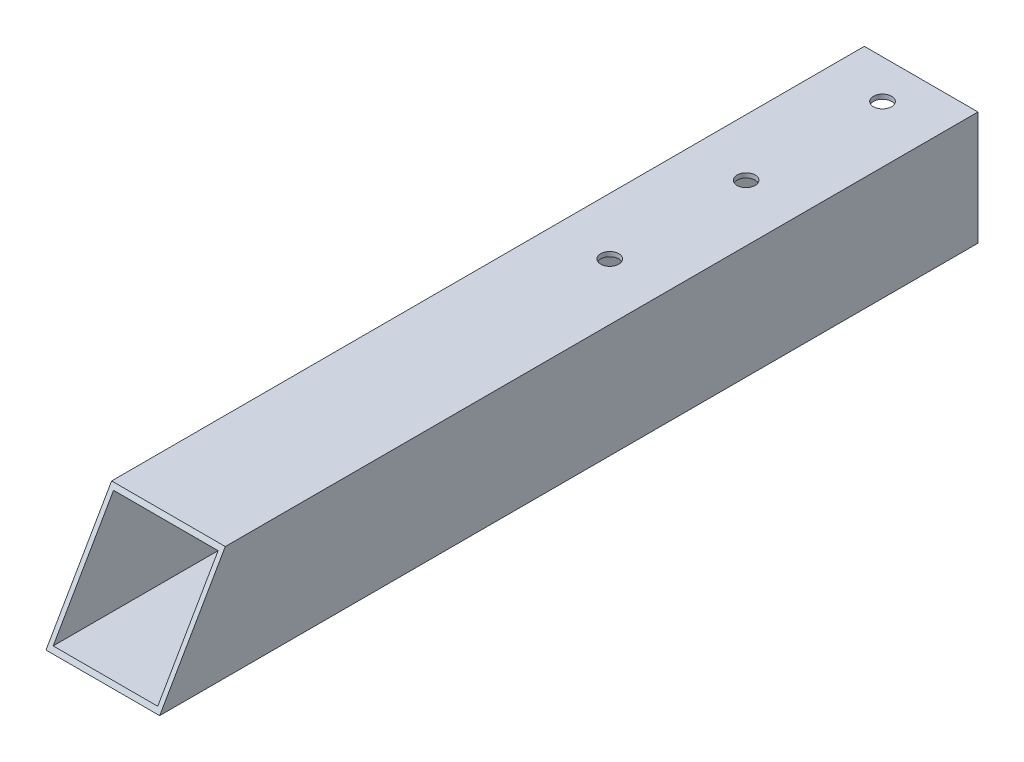
ISO-10303-21;
HEADER;
FILE_DESCRIPTION(('STEP AP214'),'2;1');
FILE_NAME('part.step','',(''),(''),'','','');
FILE_SCHEMA(('AUTOMOTIVE_DESIGN { 1 0 10303 214 1 1 1 1 }'));
ENDSEC;
DATA;
#1=APPLICATION_CONTEXT('core data for automotive mechanical design processes');
#2=APPLICATION_PROTOCOL_DEFINITION('international standard','automotive_design',2000,#1);
#3=PRODUCT_CONTEXT('',#1,'mechanical');
#4=PRODUCT('Part','Part','',(#3));
#5=PRODUCT_RELATED_PRODUCT_CATEGORY('part','',(#4));
#6=PRODUCT_DEFINITION_FORMATION('','',#4);
#7=PRODUCT_DEFINITION_CONTEXT('part definition',#1,'design');
#8=PRODUCT_DEFINITION('design','',#6,#7);
#9=PRODUCT_DEFINITION_SHAPE('','',#8);
#10=(LENGTH_UNIT() NAMED_UNIT(*) SI_UNIT(.MILLI.,.METRE.));
#11=(NAMED_UNIT(*) PLANE_ANGLE_UNIT() SI_UNIT($,.RADIAN.));
#12=(NAMED_UNIT(*) SI_UNIT($,.STERADIAN.) SOLID_ANGLE_UNIT());
#13=UNCERTAINTY_MEASURE_WITH_UNIT(LENGTH_MEASURE(1.E-05),#10,'distance_accuracy_value','');
#14=(GEOMETRIC_REPRESENTATION_CONTEXT(3) GLOBAL_UNCERTAINTY_ASSIGNED_CONTEXT((#13)) GLOBAL_UNIT_ASSIGNED_CONTEXT((#10,
#11,#12)) REPRESENTATION_CONTEXT('',''));
#15=CARTESIAN_POINT('',(0.,0.,0.));
#16=DIRECTION('',(0.,0.,1.));
#17=DIRECTION('',(1.,0.,0.));
#18=AXIS2_PLACEMENT_3D('',#15,#16,#17);
#19=CARTESIAN_POINT('',(0.,0.,0.));
#20=DIRECTION('',(0.,0.,-1.));
#21=DIRECTION('',(-1.,0.,0.));
#22=AXIS2_PLACEMENT_3D('',#19,#20,#21);
#23=PLANE('',#22);
#24=DIRECTION('',(0.,1.,0.));
#25=VECTOR('',#24,1.);
#26=CARTESIAN_POINT('',(12.5,-12.5,0.));
#27=LINE('',#26,#25);
#28=CARTESIAN_POINT('',(12.5,-12.5,0.));
#29=VERTEX_POINT('',#28);
#30=CARTESIAN_POINT('',(12.5,12.5,0.));
#31=VERTEX_POINT('',#30);
#32=EDGE_CURVE('E137',#29,#31,#27,.T.);
#33=ORIENTED_EDGE('',*,*,#32,.F.);
#34=DIRECTION('',(1.,0.,0.));
#35=VECTOR('',#34,1.);
#36=CARTESIAN_POINT('',(-12.5,-12.5,0.));
#37=LINE('',#36,#35);
#38=CARTESIAN_POINT('',(-12.5,-12.5,0.));
#39=VERTEX_POINT('',#38);
#40=EDGE_CURVE('E132',#39,#29,#37,.T.);
#41=ORIENTED_EDGE('',*,*,#40,.F.);
#42=DIRECTION('',(0.,-1.,0.));
#43=VECTOR('',#42,1.);
#44=CARTESIAN_POINT('',(-12.5,-12.5,0.));
#45=LINE('',#44,#43);
#46=CARTESIAN_POINT('',(-12.5,12.5,0.));
#47=VERTEX_POINT('',#46);
#48=EDGE_CURVE('E134',#47,#39,#45,.T.);
#49=ORIENTED_EDGE('',*,*,#48,.F.);
#50=DIRECTION('',(-1.,0.,0.));
#51=VECTOR('',#50,1.);
#52=CARTESIAN_POINT('',(-12.5,12.5,0.));
#53=LINE('',#52,#51);
#54=EDGE_CURVE('E123',#31,#47,#53,.T.);
#55=ORIENTED_EDGE('',*,*,#54,.F.);
#56=EDGE_LOOP('',(#33,#41,#49,#55));
#57=FACE_BOUND('',#56,.T.);
#58=DIRECTION('',(-1.,0.,0.));
#59=VECTOR('',#58,1.);
#60=CARTESIAN_POINT('',(-11.5,11.5,0.));
#61=LINE('',#60,#59);
#62=CARTESIAN_POINT('',(11.5,11.5,0.));
#63=VERTEX_POINT('',#62);
#64=CARTESIAN_POINT('',(-11.5,11.5,0.));
#65=VERTEX_POINT('',#64);
#66=EDGE_CURVE('E148',#63,#65,#61,.T.);
#67=ORIENTED_EDGE('',*,*,#66,.T.);
#68=DIRECTION('',(0.,-1.,0.));
#69=VECTOR('',#68,1.);
#70=CARTESIAN_POINT('',(-11.5,-11.5,0.));
#71=LINE('',#70,#69);
#72=CARTESIAN_POINT('',(-11.5,-11.5,0.));
#73=VERTEX_POINT('',#72);
#74=EDGE_CURVE('E157',#65,#73,#71,.T.);
#75=ORIENTED_EDGE('',*,*,#74,.T.);
#76=DIRECTION('',(1.,0.,0.));
#77=VECTOR('',#76,1.);
#78=CARTESIAN_POINT('',(-11.5,-11.5,0.));
#79=LINE('',#78,#77);
#80=CARTESIAN_POINT('',(11.5,-11.5,0.));
#81=VERTEX_POINT('',#80);
#82=EDGE_CURVE('E154',#73,#81,#79,.T.);
#83=ORIENTED_EDGE('',*,*,#82,.T.);
#84=DIRECTION('',(0.,1.,0.));
#85=VECTOR('',#84,1.);
#86=CARTESIAN_POINT('',(11.5,-11.5,0.));
#87=LINE('',#86,#85);
#88=EDGE_CURVE('E151',#81,#63,#87,.T.);
#89=ORIENTED_EDGE('',*,*,#88,.T.);
#90=EDGE_LOOP('',(#67,#75,#83,#89));
#91=FACE_BOUND('',#90,.T.);
#92=ADVANCED_FACE('F37',(#57,#91),#23,.T.);
#93=CARTESIAN_POINT('',(12.5,-12.5,180.));
#94=DIRECTION('',(-1.,0.,0.));
#95=DIRECTION('',(0.,0.,1.));
#96=AXIS2_PLACEMENT_3D('',#93,#94,#95);
#97=PLANE('',#96);
#98=DIRECTION('',(0.,0.,-1.));
#99=VECTOR('',#98,1.);
#100=CARTESIAN_POINT('',(12.5,12.5,180.));
#101=LINE('',#100,#99);
#102=CARTESIAN_POINT('',(12.5,12.5,165.56624327026));
#103=VERTEX_POINT('',#102);
#104=EDGE_CURVE('E45',#103,#31,#101,.T.);
#105=ORIENTED_EDGE('',*,*,#104,.F.);
#106=DIRECTION('',(0.,0.866025403784442,-0.499999999999994));
#107=VECTOR('',#106,1.);
#108=CARTESIAN_POINT('',(12.5,-12.5,180.));
#109=LINE('',#108,#107);
#110=CARTESIAN_POINT('',(12.5,-12.5,180.));
#111=VERTEX_POINT('',#110);
#112=EDGE_CURVE('E107',#111,#103,#109,.T.);
#113=ORIENTED_EDGE('',*,*,#112,.F.);
#114=DIRECTION('',(0.,0.,-1.));
#115=VECTOR('',#114,1.);
#116=CARTESIAN_POINT('',(12.5,-12.5,180.));
#117=LINE('',#116,#115);
#118=EDGE_CURVE('E126',#111,#29,#117,.T.);
#119=ORIENTED_EDGE('',*,*,#118,.T.);
#120=ORIENTED_EDGE('',*,*,#32,.T.);
#121=EDGE_LOOP('',(#105,#113,#119,#120));
#122=FACE_BOUND('',#121,.T.);
#123=ADVANCED_FACE('F39',(#122),#97,.F.);
#124=CARTESIAN_POINT('',(-12.5,12.5,180.));
#125=DIRECTION('',(0.,-1.,0.));
#126=DIRECTION('',(0.,0.,-1.));
#127=AXIS2_PLACEMENT_3D('',#124,#125,#126);
#128=PLANE('',#127);
#129=CARTESIAN_POINT('',(0.,12.5,8.5));
#130=DIRECTION('',(0.,1.,0.));
#131=DIRECTION('',(0.,0.,1.));
#132=AXIS2_PLACEMENT_3D('',#129,#130,#131);
#133=CIRCLE('',#132,2.);
#134=CARTESIAN_POINT('',(0.,12.5,10.5));
#135=VERTEX_POINT('',#134);
#136=EDGE_CURVE('E164',#135,#135,#133,.T.);
#137=ORIENTED_EDGE('',*,*,#136,.F.);
#138=EDGE_LOOP('',(#137));
#139=FACE_BOUND('',#138,.T.);
#140=CARTESIAN_POINT('',(0.,12.5,38.5));
#141=DIRECTION('',(0.,1.,0.));
#142=DIRECTION('',(0.,0.,1.));
#143=AXIS2_PLACEMENT_3D('',#140,#141,#142);
#144=CIRCLE('',#143,2.);
#145=CARTESIAN_POINT('',(0.,12.5,40.5));
#146=VERTEX_POINT('',#145);
#147=EDGE_CURVE('E172',#146,#146,#144,.T.);
#148=ORIENTED_EDGE('',*,*,#147,.F.);
#149=EDGE_LOOP('',(#148));
#150=FACE_BOUND('',#149,.T.);
#151=CARTESIAN_POINT('',(0.,12.5,68.5));
#152=DIRECTION('',(0.,1.,0.));
#153=DIRECTION('',(0.,0.,1.));
#154=AXIS2_PLACEMENT_3D('',#151,#152,#153);
#155=CIRCLE('',#154,2.);
#156=CARTESIAN_POINT('',(0.,12.5,70.5));
#157=VERTEX_POINT('',#156);
#158=EDGE_CURVE('E166',#157,#157,#155,.T.);
#159=ORIENTED_EDGE('',*,*,#158,.F.);
#160=EDGE_LOOP('',(#159));
#161=FACE_BOUND('',#160,.T.);
#162=DIRECTION('',(0.,0.,-1.));
#163=VECTOR('',#162,1.);
#164=CARTESIAN_POINT('',(-12.5,12.5,180.));
#165=LINE('',#164,#163);
#166=CARTESIAN_POINT('',(-12.5,12.5,165.56624327026));
#167=VERTEX_POINT('',#166);
#168=EDGE_CURVE('E115',#167,#47,#165,.T.);
#169=ORIENTED_EDGE('',*,*,#168,.F.);
#170=DIRECTION('',(1.,0.,0.));
#171=VECTOR('',#170,1.);
#172=CARTESIAN_POINT('',(-12.5,12.5,165.56624327026));
#173=LINE('',#172,#171);
#174=EDGE_CURVE('E101',#167,#103,#173,.T.);
#175=ORIENTED_EDGE('',*,*,#174,.T.);
#176=ORIENTED_EDGE('',*,*,#104,.T.);
#177=ORIENTED_EDGE('',*,*,#54,.T.);
#178=EDGE_LOOP('',(#169,#175,#176,#177));
#179=FACE_BOUND('',#178,.T.);
#180=ADVANCED_FACE('F121',(#139,#150,#161,#179),#128,.F.);
#181=CARTESIAN_POINT('',(-12.5,-12.5,180.));
#182=DIRECTION('',(1.,0.,0.));
#183=DIRECTION('',(0.,0.,-1.));
#184=AXIS2_PLACEMENT_3D('',#181,#182,#183);
#185=PLANE('',#184);
#186=DIRECTION('',(0.,0.,-1.));
#187=VECTOR('',#186,1.);
#188=CARTESIAN_POINT('',(-12.5,-12.5,180.));
#189=LINE('',#188,#187);
#190=CARTESIAN_POINT('',(-12.5,-12.5,180.));
#191=VERTEX_POINT('',#190);
#192=EDGE_CURVE('E118',#191,#39,#189,.T.);
#193=ORIENTED_EDGE('',*,*,#192,.F.);
#194=DIRECTION('',(0.,0.866025403784442,-0.499999999999994));
#195=VECTOR('',#194,1.);
#196=CARTESIAN_POINT('',(-12.5,-12.5,180.));
#197=LINE('',#196,#195);
#198=EDGE_CURVE('E104',#191,#167,#197,.T.);
#199=ORIENTED_EDGE('',*,*,#198,.T.);
#200=ORIENTED_EDGE('',*,*,#168,.T.);
#201=ORIENTED_EDGE('',*,*,#48,.T.);
#202=EDGE_LOOP('',(#193,#199,#200,#201));
#203=FACE_BOUND('',#202,.T.);
#204=ADVANCED_FACE('F114',(#203),#185,.F.);
#205=CARTESIAN_POINT('',(-12.5,-12.5,180.));
#206=DIRECTION('',(0.,1.,0.));
#207=DIRECTION('',(0.,0.,1.));
#208=AXIS2_PLACEMENT_3D('',#205,#206,#207);
#209=PLANE('',#208);
#210=ORIENTED_EDGE('',*,*,#40,.T.);
#211=ORIENTED_EDGE('',*,*,#118,.F.);
#212=DIRECTION('',(1.,0.,0.));
#213=VECTOR('',#212,1.);
#214=CARTESIAN_POINT('',(-12.5,-12.5,180.));
#215=LINE('',#214,#213);
#216=EDGE_CURVE('E131',#191,#111,#215,.T.);
#217=ORIENTED_EDGE('',*,*,#216,.F.);
#218=ORIENTED_EDGE('',*,*,#192,.T.);
#219=EDGE_LOOP('',(#210,#211,#217,#218));
#220=FACE_BOUND('',#219,.T.);
#221=ADVANCED_FACE('F219',(#220),#209,.F.);
#222=CARTESIAN_POINT('',(-11.5,-11.5,180.));
#223=DIRECTION('',(1.,0.,0.));
#224=DIRECTION('',(0.,0.,-1.));
#225=AXIS2_PLACEMENT_3D('',#222,#223,#224);
#226=PLANE('',#225);
#227=DIRECTION('',(0.,0.866025403784442,-0.499999999999994));
#228=VECTOR('',#227,1.);
#229=CARTESIAN_POINT('',(-11.5,-11.75,179.566987298108));
#230=LINE('',#229,#228);
#231=CARTESIAN_POINT('',(-11.5,-11.5,179.42264973081));
#232=VERTEX_POINT('',#231);
#233=CARTESIAN_POINT('',(-11.5,11.5,166.143593539449));
#234=VERTEX_POINT('',#233);
#235=EDGE_CURVE('E51',#232,#234,#230,.T.);
#236=ORIENTED_EDGE('',*,*,#235,.F.);
#237=DIRECTION('',(0.,0.,-1.));
#238=VECTOR('',#237,1.);
#239=CARTESIAN_POINT('',(-11.5,-11.5,180.));
#240=LINE('',#239,#238);
#241=EDGE_CURVE('E140',#232,#73,#240,.T.);
#242=ORIENTED_EDGE('',*,*,#241,.T.);
#243=ORIENTED_EDGE('',*,*,#74,.F.);
#244=DIRECTION('',(0.,0.,-1.));
#245=VECTOR('',#244,1.);
#246=CARTESIAN_POINT('',(-11.5,11.5,180.));
#247=LINE('',#246,#245);
#248=EDGE_CURVE('E58',#234,#65,#247,.T.);
#249=ORIENTED_EDGE('',*,*,#248,.F.);
#250=EDGE_LOOP('',(#236,#242,#243,#249));
#251=FACE_BOUND('',#250,.T.);
#252=ADVANCED_FACE('F217',(#251),#226,.T.);
#253=CARTESIAN_POINT('',(-11.5,-11.5,180.));
#254=DIRECTION('',(0.,1.,0.));
#255=DIRECTION('',(0.,0.,1.));
#256=AXIS2_PLACEMENT_3D('',#253,#254,#255);
#257=PLANE('',#256);
#258=DIRECTION('',(-1.,0.,0.));
#259=VECTOR('',#258,1.);
#260=CARTESIAN_POINT('',(-11.5,-11.5,179.42264973081));
#261=LINE('',#260,#259);
#262=CARTESIAN_POINT('',(11.5,-11.5,179.42264973081));
#263=VERTEX_POINT('',#262);
#264=EDGE_CURVE('E161',#263,#232,#261,.T.);
#265=ORIENTED_EDGE('',*,*,#264,.F.);
#266=DIRECTION('',(0.,0.,-1.));
#267=VECTOR('',#266,1.);
#268=CARTESIAN_POINT('',(11.5,-11.5,180.));
#269=LINE('',#268,#267);
#270=EDGE_CURVE('E143',#263,#81,#269,.T.);
#271=ORIENTED_EDGE('',*,*,#270,.T.);
#272=ORIENTED_EDGE('',*,*,#82,.F.);
#273=ORIENTED_EDGE('',*,*,#241,.F.);
#274=EDGE_LOOP('',(#265,#271,#272,#273));
#275=FACE_BOUND('',#274,.T.);
#276=ADVANCED_FACE('F239',(#275),#257,.T.);
#277=CARTESIAN_POINT('',(11.5,-11.5,180.));
#278=DIRECTION('',(-1.,0.,0.));
#279=DIRECTION('',(0.,-1.,0.));
#280=AXIS2_PLACEMENT_3D('',#277,#278,#279);
#281=PLANE('',#280);
#282=DIRECTION('',(0.,-0.866025403784442,0.499999999999994));
#283=VECTOR('',#282,1.);
#284=CARTESIAN_POINT('',(11.5,-11.75,179.566987298108));
#285=LINE('',#284,#283);
#286=CARTESIAN_POINT('',(11.5,11.5,166.143593539449));
#287=VERTEX_POINT('',#286);
#288=EDGE_CURVE('E111',#287,#263,#285,.T.);
#289=ORIENTED_EDGE('',*,*,#288,.F.);
#290=DIRECTION('',(0.,0.,-1.));
#291=VECTOR('',#290,1.);
#292=CARTESIAN_POINT('',(11.5,11.5,180.));
#293=LINE('',#292,#291);
#294=EDGE_CURVE('E145',#287,#63,#293,.T.);
#295=ORIENTED_EDGE('',*,*,#294,.T.);
#296=ORIENTED_EDGE('',*,*,#88,.F.);
#297=ORIENTED_EDGE('',*,*,#270,.F.);
#298=EDGE_LOOP('',(#289,#295,#296,#297));
#299=FACE_BOUND('',#298,.T.);
#300=ADVANCED_FACE('F246',(#299),#281,.T.);
#301=CARTESIAN_POINT('',(-11.5,11.5,180.));
#302=DIRECTION('',(0.,-1.,0.));
#303=DIRECTION('',(1.,0.,0.));
#304=AXIS2_PLACEMENT_3D('',#301,#302,#303);
#305=PLANE('',#304);
#306=CARTESIAN_POINT('',(0.,11.5,8.5));
#307=DIRECTION('',(0.,-1.,0.));
#308=DIRECTION('',(1.,0.,0.));
#309=AXIS2_PLACEMENT_3D('',#306,#307,#308);
#310=CIRCLE('',#309,2.);
#311=CARTESIAN_POINT('',(2.,11.5,8.5));
#312=VERTEX_POINT('',#311);
#313=EDGE_CURVE('E178',#312,#312,#310,.F.);
#314=ORIENTED_EDGE('',*,*,#313,.T.);
#315=EDGE_LOOP('',(#314));
#316=FACE_BOUND('',#315,.T.);
#317=CARTESIAN_POINT('',(0.,11.5,38.5));
#318=DIRECTION('',(0.,-1.,0.));
#319=DIRECTION('',(1.,0.,0.));
#320=AXIS2_PLACEMENT_3D('',#317,#318,#319);
#321=CIRCLE('',#320,2.);
#322=CARTESIAN_POINT('',(2.00000000000001,11.5,38.5));
#323=VERTEX_POINT('',#322);
#324=EDGE_CURVE('E175',#323,#323,#321,.F.);
#325=ORIENTED_EDGE('',*,*,#324,.T.);
#326=EDGE_LOOP('',(#325));
#327=FACE_BOUND('',#326,.T.);
#328=CARTESIAN_POINT('',(0.,11.5,68.5));
#329=DIRECTION('',(0.,-1.,0.));
#330=DIRECTION('',(1.,0.,0.));
#331=AXIS2_PLACEMENT_3D('',#328,#329,#330);
#332=CIRCLE('',#331,2.);
#333=CARTESIAN_POINT('',(2.00000000000001,11.5,68.5));
#334=VERTEX_POINT('',#333);
#335=EDGE_CURVE('E169',#334,#334,#332,.F.);
#336=ORIENTED_EDGE('',*,*,#335,.T.);
#337=EDGE_LOOP('',(#336));
#338=FACE_BOUND('',#337,.T.);
#339=DIRECTION('',(1.,0.,0.));
#340=VECTOR('',#339,1.);
#341=CARTESIAN_POINT('',(-11.5,11.5,166.143593539449));
#342=LINE('',#341,#340);
#343=EDGE_CURVE('E11',#234,#287,#342,.T.);
#344=ORIENTED_EDGE('',*,*,#343,.F.);
#345=ORIENTED_EDGE('',*,*,#248,.T.);
#346=ORIENTED_EDGE('',*,*,#66,.F.);
#347=ORIENTED_EDGE('',*,*,#294,.F.);
#348=EDGE_LOOP('',(#344,#345,#346,#347));
#349=FACE_BOUND('',#348,.T.);
#350=ADVANCED_FACE('F203',(#316,#327,#338,#349),#305,.T.);
#351=CARTESIAN_POINT('',(-12.5,-12.5,180.));
#352=DIRECTION('',(0.,-0.499999999999994,-0.866025403784442));
#353=DIRECTION('',(0.,0.866025403784442,-0.499999999999994));
#354=AXIS2_PLACEMENT_3D('',#351,#352,#353);
#355=PLANE('',#354);
#356=ORIENTED_EDGE('',*,*,#235,.T.);
#357=ORIENTED_EDGE('',*,*,#343,.T.);
#358=ORIENTED_EDGE('',*,*,#288,.T.);
#359=ORIENTED_EDGE('',*,*,#264,.T.);
#360=EDGE_LOOP('',(#356,#357,#358,#359));
#361=FACE_BOUND('',#360,.T.);
#362=ORIENTED_EDGE('',*,*,#112,.T.);
#363=ORIENTED_EDGE('',*,*,#174,.F.);
#364=ORIENTED_EDGE('',*,*,#198,.F.);
#365=ORIENTED_EDGE('',*,*,#216,.T.);
#366=EDGE_LOOP('',(#362,#363,#364,#365));
#367=FACE_BOUND('',#366,.T.);
#368=ADVANCED_FACE('F103',(#361,#367),#355,.F.);
#369=CARTESIAN_POINT('',(0.,-12.501,68.5));
#370=DIRECTION('',(0.,1.,0.));
#371=DIRECTION('',(0.,0.,1.));
#372=AXIS2_PLACEMENT_3D('',#369,#370,#371);
#373=CYLINDRICAL_SURFACE('',#372,2.);
#374=ORIENTED_EDGE('',*,*,#335,.F.);
#375=EDGE_LOOP('',(#374));
#376=FACE_BOUND('',#375,.T.);
#377=ORIENTED_EDGE('',*,*,#158,.T.);
#378=EDGE_LOOP('',(#377));
#379=FACE_BOUND('',#378,.T.);
#380=ADVANCED_FACE('F192',(#376,#379),#373,.F.);
#381=CARTESIAN_POINT('',(0.,-12.501,38.5));
#382=DIRECTION('',(0.,1.,0.));
#383=DIRECTION('',(0.,0.,1.));
#384=AXIS2_PLACEMENT_3D('',#381,#382,#383);
#385=CYLINDRICAL_SURFACE('',#384,2.);
#386=ORIENTED_EDGE('',*,*,#324,.F.);
#387=EDGE_LOOP('',(#386));
#388=FACE_BOUND('',#387,.T.);
#389=ORIENTED_EDGE('',*,*,#147,.T.);
#390=EDGE_LOOP('',(#389));
#391=FACE_BOUND('',#390,.T.);
#392=ADVANCED_FACE('F194',(#388,#391),#385,.F.);
#393=CARTESIAN_POINT('',(0.,-12.501,8.5));
#394=DIRECTION('',(0.,1.,0.));
#395=DIRECTION('',(0.,0.,1.));
#396=AXIS2_PLACEMENT_3D('',#393,#394,#395);
#397=CYLINDRICAL_SURFACE('',#396,2.);
#398=ORIENTED_EDGE('',*,*,#313,.F.);
#399=EDGE_LOOP('',(#398));
#400=FACE_BOUND('',#399,.T.);
#401=ORIENTED_EDGE('',*,*,#136,.T.);
#402=EDGE_LOOP('',(#401));
#403=FACE_BOUND('',#402,.T.);
#404=ADVANCED_FACE('F184',(#400,#403),#397,.F.);
#405=CLOSED_SHELL('',(#92,#123,#180,#204,#221,#252,#276,#300,#350,#368,#380,#392,#404));
#406=MANIFOLD_SOLID_BREP('B2',#405);
#407=ADVANCED_BREP_SHAPE_REPRESENTATION('',(#18,#406),#14);
#408=SHAPE_DEFINITION_REPRESENTATION(#9,#407);
ENDSEC;
END-ISO-10303-21;
